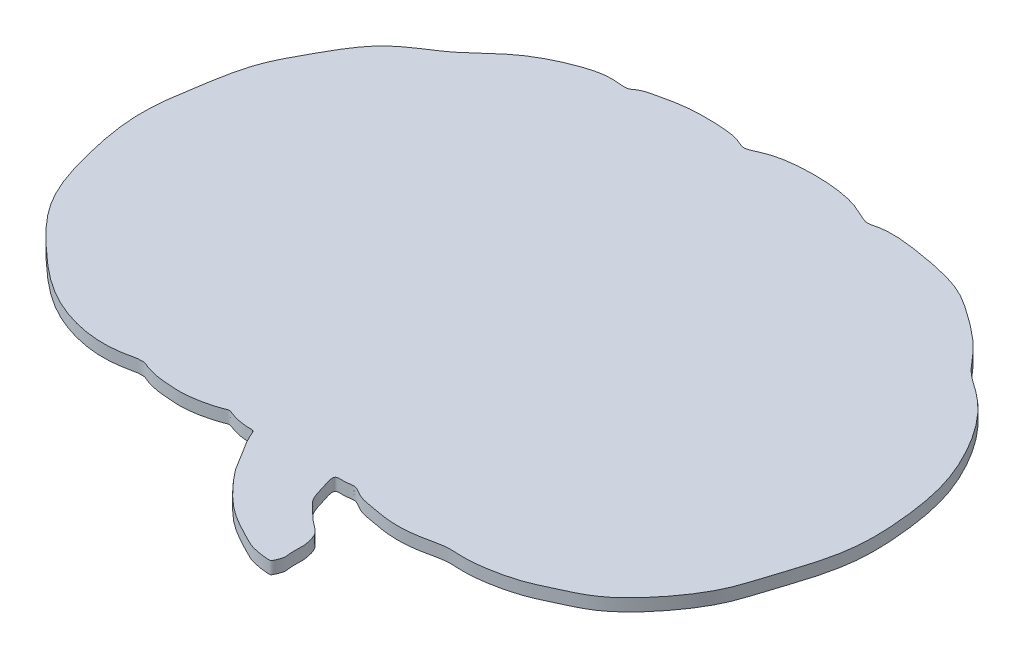
ISO-10303-21;
HEADER;
FILE_DESCRIPTION(('STEP AP214'),'2;1');
FILE_NAME('part.step','',(''),(''),'','','');
FILE_SCHEMA(('AUTOMOTIVE_DESIGN { 1 0 10303 214 1 1 1 1 }'));
ENDSEC;
DATA;
#1=APPLICATION_CONTEXT('core data for automotive mechanical design processes');
#2=APPLICATION_PROTOCOL_DEFINITION('international standard','automotive_design',2000,#1);
#3=PRODUCT_CONTEXT('',#1,'mechanical');
#4=PRODUCT('Part','Part','',(#3));
#5=PRODUCT_RELATED_PRODUCT_CATEGORY('part','',(#4));
#6=PRODUCT_DEFINITION_FORMATION('','',#4);
#7=PRODUCT_DEFINITION_CONTEXT('part definition',#1,'design');
#8=PRODUCT_DEFINITION('design','',#6,#7);
#9=PRODUCT_DEFINITION_SHAPE('','',#8);
#10=(LENGTH_UNIT() NAMED_UNIT(*) SI_UNIT(.MILLI.,.METRE.));
#11=(NAMED_UNIT(*) PLANE_ANGLE_UNIT() SI_UNIT($,.RADIAN.));
#12=(NAMED_UNIT(*) SI_UNIT($,.STERADIAN.) SOLID_ANGLE_UNIT());
#13=UNCERTAINTY_MEASURE_WITH_UNIT(LENGTH_MEASURE(1.E-05),#10,'distance_accuracy_value','');
#14=(GEOMETRIC_REPRESENTATION_CONTEXT(3) GLOBAL_UNCERTAINTY_ASSIGNED_CONTEXT((#13)) GLOBAL_UNIT_ASSIGNED_CONTEXT((#10,
#11,#12)) REPRESENTATION_CONTEXT('',''));
#15=CARTESIAN_POINT('',(0.,0.,0.));
#16=DIRECTION('',(0.,0.,1.));
#17=DIRECTION('',(1.,0.,0.));
#18=AXIS2_PLACEMENT_3D('',#15,#16,#17);
#19=CARTESIAN_POINT('',(0.,0.,0.));
#20=DIRECTION('',(0.,-1.,0.));
#21=DIRECTION('',(0.,0.,-1.));
#22=AXIS2_PLACEMENT_3D('',#19,#20,#21);
#23=PLANE('',#22);
#24=CARTESIAN_POINT('',(34.9509973087976,0.,-45.3626956249762));
#25=CARTESIAN_POINT('',(34.1648318789118,0.,-46.1780783207025));
#26=CARTESIAN_POINT('',(33.0549370221065,0.,-47.9676356757519));
#27=CARTESIAN_POINT('',(27.1539175132988,0.,-52.40684247319));
#28=CARTESIAN_POINT('',(23.6182794553938,0.,-54.2452712699349));
#29=CARTESIAN_POINT('',(12.8534720679056,0.,-56.0499630870907));
#30=CARTESIAN_POINT('',(12.2469343535942,0.,-54.3647886853069));
#31=CARTESIAN_POINT('',(8.86322205531205,0.,-56.5579069707116));
#32=CARTESIAN_POINT('',(3.23216022453953,0.,-57.2290139242764));
#33=CARTESIAN_POINT('',(-2.15734277155484,0.,-56.7336718719648));
#34=CARTESIAN_POINT('',(-4.7434260494536,0.,-55.0345734838977));
#35=CARTESIAN_POINT('',(-5.81252973568001,0.,-56.3212412821953));
#36=CARTESIAN_POINT('',(-12.5292836927238,0.,-56.5654336173178));
#37=CARTESIAN_POINT('',(-14.9011005966641,0.,-55.9708512648485));
#38=CARTESIAN_POINT('',(-18.0980057082823,0.,-55.3025034248081));
#39=CARTESIAN_POINT('',(-18.6106561539237,0.,-54.2404485284891));
#40=CARTESIAN_POINT('',(-21.5738767303892,0.,-55.1466117666649));
#41=CARTESIAN_POINT('',(-27.3011908723438,0.,-52.9405487453433));
#42=CARTESIAN_POINT('',(-30.5304348784394,0.,-50.8328972308383));
#43=CARTESIAN_POINT('',(-33.8527610583914,0.,-47.571927080901));
#44=CARTESIAN_POINT('',(-36.4992648773455,0.,-45.8390408851947));
#45=CARTESIAN_POINT('',(-40.2877536930266,0.,-43.3668654119522));
#46=CARTESIAN_POINT('',(-42.9009385773556,0.,-38.6086381094573));
#47=CARTESIAN_POINT('',(-45.9372504785452,0.,-33.1487997952934));
#48=CARTESIAN_POINT('',(-46.8674396132576,0.,-27.220903425306));
#49=CARTESIAN_POINT('',(-48.0462451026175,0.,-20.122367554084));
#50=CARTESIAN_POINT('',(-46.6575503455411,0.,-12.471424796175));
#51=CARTESIAN_POINT('',(-44.1564065638421,0.,-4.42966991852358));
#52=CARTESIAN_POINT('',(-38.4633886538594,0.,1.28950053539391));
#53=CARTESIAN_POINT('',(-31.892073124528,0.,6.89535813142171));
#54=CARTESIAN_POINT('',(-24.7193909940719,0.,8.61080562312321));
#55=CARTESIAN_POINT('',(-20.5447475654588,0.,7.49047867192958));
#56=CARTESIAN_POINT('',(-19.22741816592,0.,7.44608078692555));
#57=CARTESIAN_POINT('',(-19.2703164463389,0.,7.61579792898738));
#58=CARTESIAN_POINT('',(-17.15743419841,0.,8.24991267340965));
#59=CARTESIAN_POINT('',(-14.5157702658907,0.,8.44102486607606));
#60=CARTESIAN_POINT('',(-13.8146283634914,0.,8.49930701954197));
#61=CARTESIAN_POINT('',(-11.8487651583591,0.,8.3270822883134));
#62=CARTESIAN_POINT('',(-8.86374769848131,0.,7.58312064871491));
#63=CARTESIAN_POINT('',(-8.63195569041808,0.,7.2130316249595));
#64=CARTESIAN_POINT('',(-7.94496749089747,0.,7.55290438875189));
#65=CARTESIAN_POINT('',(-7.22759725109872,0.,7.75234182884578));
#66=CARTESIAN_POINT('',(-6.78960688613859,0.,7.88085006480238));
#67=CARTESIAN_POINT('',(-5.26803414406077,0.,8.14015117154193));
#68=CARTESIAN_POINT('',(-4.60962560377663,0.,7.88886943985154));
#69=CARTESIAN_POINT('',(-4.29045861979046,0.,9.03272670209138));
#70=CARTESIAN_POINT('',(-3.37681196753808,0.,10.5440824259577));
#71=CARTESIAN_POINT('',(-2.66016734474331,0.,11.5773933063289));
#72=CARTESIAN_POINT('',(-1.89926867406118,0.,13.2082662233058));
#73=CARTESIAN_POINT('',(0.639121853100465,0.,16.2217021048073));
#74=CARTESIAN_POINT('',(3.44333857341825,0.,18.76664007545));
#75=CARTESIAN_POINT('',(7.146851366381,0.,20.6201501214173));
#76=CARTESIAN_POINT('',(8.33094794254851,0.,21.330628057913));
#77=CARTESIAN_POINT('',(11.0122098735587,0.,21.6260503357788));
#78=CARTESIAN_POINT('',(11.129229984636,0.,21.4579486988569));
#79=CARTESIAN_POINT('',(11.6581606389544,0.,20.2781792601892));
#80=CARTESIAN_POINT('',(11.4372006099823,0.,19.5518237625111));
#81=CARTESIAN_POINT('',(11.5134542188365,0.,17.9068316562124));
#82=CARTESIAN_POINT('',(11.4780560770579,0.,17.5086542585303));
#83=CARTESIAN_POINT('',(11.0960706879022,0.,15.4814580195064));
#84=CARTESIAN_POINT('',(9.48726717121722,0.,14.5920179144904));
#85=CARTESIAN_POINT('',(8.25237386652394,0.,13.2573425736935));
#86=CARTESIAN_POINT('',(6.88329198408348,0.,12.1596034076821));
#87=CARTESIAN_POINT('',(6.37270203453716,0.,10.4918633259178));
#88=CARTESIAN_POINT('',(5.97455174690053,0.,9.36385554110563));
#89=CARTESIAN_POINT('',(5.59627817711387,0.,7.85090178616584));
#90=CARTESIAN_POINT('',(6.62951754498079,0.,7.89066331786896));
#91=CARTESIAN_POINT('',(7.29356640622377,0.,7.87806099381388));
#92=CARTESIAN_POINT('',(8.41156206616929,0.,7.6138893343645));
#93=CARTESIAN_POINT('',(9.58938086671887,0.,8.65357981888195));
#94=CARTESIAN_POINT('',(11.5587991208524,0.,8.91553572845941));
#95=CARTESIAN_POINT('',(13.7903229169481,0.,9.40880256338869));
#96=CARTESIAN_POINT('',(16.2934719612985,0.,9.46598503474049));
#97=CARTESIAN_POINT('',(18.7268902473448,0.,9.08247804704591));
#98=CARTESIAN_POINT('',(20.917712941431,0.,8.51147301324402));
#99=CARTESIAN_POINT('',(23.4709440930153,0.,8.77858094965656));
#100=CARTESIAN_POINT('',(26.5409583759049,0.,8.39461958084574));
#101=CARTESIAN_POINT('',(29.827797246456,0.,7.60478503927771));
#102=CARTESIAN_POINT('',(32.851151810427,0.,6.11872652186266));
#103=CARTESIAN_POINT('',(36.0860843340558,0.,4.7021332183532));
#104=CARTESIAN_POINT('',(38.9006861000655,0.,2.17343982769089));
#105=CARTESIAN_POINT('',(41.6136480516723,0.,-1.15212690440931));
#106=CARTESIAN_POINT('',(43.839095788238,0.,-4.72368982874038));
#107=CARTESIAN_POINT('',(44.9953954961734,0.,-8.78474733678848));
#108=CARTESIAN_POINT('',(46.4495729027659,0.,-12.9853398638002));
#109=CARTESIAN_POINT('',(47.7006865860593,0.,-18.1611121398252));
#110=CARTESIAN_POINT('',(47.3841801117967,0.,-24.4441042811033));
#111=CARTESIAN_POINT('',(46.358082644211,0.,-30.6699951624975));
#112=CARTESIAN_POINT('',(43.4283166080899,0.,-37.1290253509225));
#113=CARTESIAN_POINT('',(39.5721426576781,0.,-42.2570424563532));
#114=CARTESIAN_POINT('',(35.8965458653564,0.,-44.3820064447117));
#115=CARTESIAN_POINT('',(34.9509973087976,0.,-45.3626956249762));
#116=B_SPLINE_CURVE_WITH_KNOTS('',3,(#24,#25,#26,#27,#28,#29,#30,#31,#32,#33,#34,#35,#36,#37,
#38,#39,#40,#41,#42,#43,#44,#45,#46,#47,#48,#49,#50,#51,#52,#53,#54,#55,#56,#57,#58,#59,#60,#61,
#62,#63,#64,#65,#66,#67,#68,#69,#70,#71,#72,#73,#74,#75,#76,#77,#78,#79,#80,#81,#82,#83,#84,#85,
#86,#87,#88,#89,#90,#91,#92,#93,#94,#95,#96,#97,#98,#99,#100,#101,#102,#103,#104,#105,#106,#107,
#108,#109,#110,#111,#112,#113,#114,#115),.UNSPECIFIED.,.T.,.F.,(4,1,1,1,1,1,1,1,1,1,1,1,1,1,1,1,
1,1,1,1,1,1,1,1,1,1,1,1,1,1,1,1,1,1,1,1,1,1,1,1,1,1,1,1,1,1,1,1,1,1,1,1,1,1,1,1,1,1,1,1,1,1,1,1,
1,1,1,1,1,1,1,1,1,1,1,1,1,1,1,1,1,1,1,1,1,1,1,1,1,4),(0.,0.0125814386226231,0.0218514061170352,
0.0301924514794335,0.0374553802718955,0.0488038078827929,0.056374420789825,0.0641591201125045,
0.0724509547377633,0.0789834564452678,0.0853481823300178,0.092327958093714,0.100034411981791,
0.10184947183712,0.110478556646997,0.123680031086422,0.143068748846985,0.164045512915518,
0.177916207760092,0.185937090895329,0.201348709841306,0.22782480589882,0.246133935926436,
0.271974478271912,0.295025884887771,0.327362491750029,0.359184617834551,0.388613557623827,
0.416913063350752,0.457724703544346,0.463497906359028,0.465472854854284,0.471845881352735,
0.477112479410839,0.480366301448872,0.488424721528467,0.493818067322784,0.498708146191368,
0.5072626071286,0.510940013169176,0.513494468858515,0.515545521544574,0.518533956062368,
0.522910128798632,0.528108254556488,0.532183910092034,0.537728084756887,0.543638757532093,
0.560426517080213,0.576701385675919,0.589340543005376,0.602104402721321,0.605118156182342,
0.607694702401963,0.610196989906367,0.613016072015652,0.616872562158115,0.621645706455579,
0.628107162026627,0.635128646227728,0.64204002199259,0.648735677640917,0.654608596534122,
0.660605327002483,0.664713640995276,0.666968380765842,0.670250720154977,0.672851240880322,
0.679498598428284,0.686578931445382,0.695055102297144,0.705493222321617,0.714679808801071,
0.72300683456972,0.730908159023916,0.7434826002214,0.757962921142584,0.76898454603161,
0.781635938733515,0.797818766906545,0.81119517792303,0.830417450262681,0.844928744698076,
0.85887539125712,0.880944318971677,0.904719026867751,0.929732105070654,0.951984408162297,
0.98486786536673,1.),.UNSPECIFIED.);
#117=CARTESIAN_POINT('',(34.9509973087976,0.,-45.3626956249762));
#118=VERTEX_POINT('',#117);
#119=EDGE_CURVE('E37',#118,#118,#116,.T.);
#120=ORIENTED_EDGE('',*,*,#119,.T.);
#121=EDGE_LOOP('',(#120));
#122=FACE_BOUND('',#121,.T.);
#123=ADVANCED_FACE('F34',(#122),#23,.F.);
#124=CARTESIAN_POINT('',(34.9509973087976,-1.6,-45.3626956249762));
#125=CARTESIAN_POINT('',(34.1648318789118,-1.6,-46.1780783207025));
#126=CARTESIAN_POINT('',(33.0549370221065,-1.6,-47.9676356757519));
#127=CARTESIAN_POINT('',(27.1539175132988,-1.6,-52.40684247319));
#128=CARTESIAN_POINT('',(23.6182794553938,-1.6,-54.2452712699349));
#129=CARTESIAN_POINT('',(12.8534720679056,-1.6,-56.0499630870907));
#130=CARTESIAN_POINT('',(12.2469343535942,-1.6,-54.3647886853069));
#131=CARTESIAN_POINT('',(8.86322205531205,-1.6,-56.5579069707116));
#132=CARTESIAN_POINT('',(3.23216022453953,-1.6,-57.2290139242764));
#133=CARTESIAN_POINT('',(-2.15734277155484,-1.6,-56.7336718719648));
#134=CARTESIAN_POINT('',(-4.7434260494536,-1.6,-55.0345734838977));
#135=CARTESIAN_POINT('',(-5.81252973568001,-1.6,-56.3212412821953));
#136=CARTESIAN_POINT('',(-12.5292836927238,-1.6,-56.5654336173178));
#137=CARTESIAN_POINT('',(-14.9011005966641,-1.6,-55.9708512648485));
#138=CARTESIAN_POINT('',(-18.0980057082823,-1.6,-55.3025034248081));
#139=CARTESIAN_POINT('',(-18.6106561539237,-1.6,-54.2404485284891));
#140=CARTESIAN_POINT('',(-21.5738767303892,-1.6,-55.1466117666649));
#141=CARTESIAN_POINT('',(-27.3011908723438,-1.6,-52.9405487453433));
#142=CARTESIAN_POINT('',(-30.5304348784394,-1.6,-50.8328972308383));
#143=CARTESIAN_POINT('',(-33.8527610583914,-1.6,-47.571927080901));
#144=CARTESIAN_POINT('',(-36.4992648773455,-1.6,-45.8390408851947));
#145=CARTESIAN_POINT('',(-40.2877536930266,-1.6,-43.3668654119522));
#146=CARTESIAN_POINT('',(-42.9009385773556,-1.6,-38.6086381094573));
#147=CARTESIAN_POINT('',(-45.9372504785452,-1.6,-33.1487997952934));
#148=CARTESIAN_POINT('',(-46.8674396132576,-1.6,-27.220903425306));
#149=CARTESIAN_POINT('',(-48.0462451026175,-1.6,-20.122367554084));
#150=CARTESIAN_POINT('',(-46.6575503455411,-1.6,-12.471424796175));
#151=CARTESIAN_POINT('',(-44.1564065638421,-1.6,-4.42966991852358));
#152=CARTESIAN_POINT('',(-38.4633886538594,-1.6,1.28950053539391));
#153=CARTESIAN_POINT('',(-31.892073124528,-1.6,6.89535813142171));
#154=CARTESIAN_POINT('',(-24.7193909940719,-1.6,8.61080562312321));
#155=CARTESIAN_POINT('',(-20.5447475654588,-1.6,7.49047867192958));
#156=CARTESIAN_POINT('',(-19.22741816592,-1.6,7.44608078692555));
#157=CARTESIAN_POINT('',(-19.2703164463389,-1.6,7.61579792898738));
#158=CARTESIAN_POINT('',(-17.15743419841,-1.6,8.24991267340965));
#159=CARTESIAN_POINT('',(-14.5157702658907,-1.6,8.44102486607606));
#160=CARTESIAN_POINT('',(-13.8146283634914,-1.6,8.49930701954197));
#161=CARTESIAN_POINT('',(-11.8487651583591,-1.6,8.3270822883134));
#162=CARTESIAN_POINT('',(-8.86374769848131,-1.6,7.58312064871491));
#163=CARTESIAN_POINT('',(-8.63195569041808,-1.6,7.2130316249595));
#164=CARTESIAN_POINT('',(-7.94496749089747,-1.6,7.55290438875189));
#165=CARTESIAN_POINT('',(-7.22759725109872,-1.6,7.75234182884578));
#166=CARTESIAN_POINT('',(-6.78960688613859,-1.6,7.88085006480238));
#167=CARTESIAN_POINT('',(-5.26803414406077,-1.6,8.14015117154193));
#168=CARTESIAN_POINT('',(-4.60962560377663,-1.6,7.88886943985154));
#169=CARTESIAN_POINT('',(-4.29045861979046,-1.6,9.03272670209138));
#170=CARTESIAN_POINT('',(-3.37681196753808,-1.6,10.5440824259577));
#171=CARTESIAN_POINT('',(-2.66016734474331,-1.6,11.5773933063289));
#172=CARTESIAN_POINT('',(-1.89926867406118,-1.6,13.2082662233058));
#173=CARTESIAN_POINT('',(0.639121853100465,-1.6,16.2217021048073));
#174=CARTESIAN_POINT('',(3.44333857341825,-1.6,18.76664007545));
#175=CARTESIAN_POINT('',(7.146851366381,-1.6,20.6201501214173));
#176=CARTESIAN_POINT('',(8.33094794254851,-1.6,21.330628057913));
#177=CARTESIAN_POINT('',(11.0122098735587,-1.6,21.6260503357788));
#178=CARTESIAN_POINT('',(11.129229984636,-1.6,21.4579486988569));
#179=CARTESIAN_POINT('',(11.6581606389544,-1.6,20.2781792601892));
#180=CARTESIAN_POINT('',(11.4372006099823,-1.6,19.5518237625111));
#181=CARTESIAN_POINT('',(11.5134542188365,-1.6,17.9068316562124));
#182=CARTESIAN_POINT('',(11.4780560770579,-1.6,17.5086542585303));
#183=CARTESIAN_POINT('',(11.0960706879022,-1.6,15.4814580195064));
#184=CARTESIAN_POINT('',(9.48726717121722,-1.6,14.5920179144904));
#185=CARTESIAN_POINT('',(8.25237386652394,-1.6,13.2573425736935));
#186=CARTESIAN_POINT('',(6.88329198408348,-1.6,12.1596034076821));
#187=CARTESIAN_POINT('',(6.37270203453716,-1.6,10.4918633259178));
#188=CARTESIAN_POINT('',(5.97455174690053,-1.6,9.36385554110563));
#189=CARTESIAN_POINT('',(5.59627817711387,-1.6,7.85090178616584));
#190=CARTESIAN_POINT('',(6.62951754498079,-1.6,7.89066331786896));
#191=CARTESIAN_POINT('',(7.29356640622377,-1.6,7.87806099381388));
#192=CARTESIAN_POINT('',(8.41156206616929,-1.6,7.6138893343645));
#193=CARTESIAN_POINT('',(9.58938086671887,-1.6,8.65357981888195));
#194=CARTESIAN_POINT('',(11.5587991208524,-1.6,8.91553572845941));
#195=CARTESIAN_POINT('',(13.7903229169481,-1.6,9.40880256338869));
#196=CARTESIAN_POINT('',(16.2934719612985,-1.6,9.46598503474049));
#197=CARTESIAN_POINT('',(18.7268902473448,-1.6,9.08247804704591));
#198=CARTESIAN_POINT('',(20.917712941431,-1.6,8.51147301324402));
#199=CARTESIAN_POINT('',(23.4709440930153,-1.6,8.77858094965656));
#200=CARTESIAN_POINT('',(26.5409583759049,-1.6,8.39461958084574));
#201=CARTESIAN_POINT('',(29.827797246456,-1.6,7.60478503927771));
#202=CARTESIAN_POINT('',(32.851151810427,-1.6,6.11872652186266));
#203=CARTESIAN_POINT('',(36.0860843340558,-1.6,4.7021332183532));
#204=CARTESIAN_POINT('',(38.9006861000655,-1.6,2.17343982769089));
#205=CARTESIAN_POINT('',(41.6136480516723,-1.6,-1.15212690440931));
#206=CARTESIAN_POINT('',(43.839095788238,-1.6,-4.72368982874038));
#207=CARTESIAN_POINT('',(44.9953954961734,-1.6,-8.78474733678848));
#208=CARTESIAN_POINT('',(46.4495729027659,-1.6,-12.9853398638002));
#209=CARTESIAN_POINT('',(47.7006865860593,-1.6,-18.1611121398252));
#210=CARTESIAN_POINT('',(47.3841801117967,-1.6,-24.4441042811033));
#211=CARTESIAN_POINT('',(46.358082644211,-1.6,-30.6699951624975));
#212=CARTESIAN_POINT('',(43.4283166080899,-1.6,-37.1290253509225));
#213=CARTESIAN_POINT('',(39.5721426576781,-1.6,-42.2570424563532));
#214=CARTESIAN_POINT('',(35.8965458653564,-1.6,-44.3820064447117));
#215=CARTESIAN_POINT('',(34.9509973087976,-1.6,-45.3626956249762));
#216=B_SPLINE_CURVE_WITH_KNOTS('',3,(#124,#125,#126,#127,#128,#129,#130,#131,#132,#133,#134,
#135,#136,#137,#138,#139,#140,#141,#142,#143,#144,#145,#146,#147,#148,#149,#150,#151,#152,#153,
#154,#155,#156,#157,#158,#159,#160,#161,#162,#163,#164,#165,#166,#167,#168,#169,#170,#171,#172,
#173,#174,#175,#176,#177,#178,#179,#180,#181,#182,#183,#184,#185,#186,#187,#188,#189,#190,#191,
#192,#193,#194,#195,#196,#197,#198,#199,#200,#201,#202,#203,#204,#205,#206,#207,#208,#209,#210,
#211,#212,#213,#214,#215),.UNSPECIFIED.,.T.,.F.,(4,1,1,1,1,1,1,1,1,1,1,1,1,1,1,1,1,1,1,1,1,1,1,
1,1,1,1,1,1,1,1,1,1,1,1,1,1,1,1,1,1,1,1,1,1,1,1,1,1,1,1,1,1,1,1,1,1,1,1,1,1,1,1,1,1,1,1,1,1,1,1,
1,1,1,1,1,1,1,1,1,1,1,1,1,1,1,1,1,1,4),(0.,0.0125814386226231,0.0218514061170352,
0.0301924514794335,0.0374553802718955,0.0488038078827929,0.056374420789825,0.0641591201125045,
0.0724509547377633,0.0789834564452678,0.0853481823300178,0.092327958093714,0.100034411981791,
0.10184947183712,0.110478556646997,0.123680031086422,0.143068748846985,0.164045512915518,
0.177916207760092,0.185937090895329,0.201348709841306,0.22782480589882,0.246133935926436,
0.271974478271912,0.295025884887771,0.327362491750029,0.359184617834551,0.388613557623827,
0.416913063350752,0.457724703544346,0.463497906359028,0.465472854854284,0.471845881352735,
0.477112479410839,0.480366301448872,0.488424721528467,0.493818067322784,0.498708146191368,
0.5072626071286,0.510940013169176,0.513494468858515,0.515545521544574,0.518533956062368,
0.522910128798632,0.528108254556488,0.532183910092034,0.537728084756887,0.543638757532093,
0.560426517080213,0.576701385675919,0.589340543005376,0.602104402721321,0.605118156182342,
0.607694702401963,0.610196989906367,0.613016072015652,0.616872562158115,0.621645706455579,
0.628107162026627,0.635128646227728,0.64204002199259,0.648735677640917,0.654608596534122,
0.660605327002483,0.664713640995276,0.666968380765842,0.670250720154977,0.672851240880322,
0.679498598428284,0.686578931445382,0.695055102297144,0.705493222321617,0.714679808801071,
0.72300683456972,0.730908159023916,0.7434826002214,0.757962921142584,0.76898454603161,
0.781635938733515,0.797818766906545,0.81119517792303,0.830417450262681,0.844928744698076,
0.85887539125712,0.880944318971677,0.904719026867751,0.929732105070654,0.951984408162297,
0.98486786536673,1.),.UNSPECIFIED.);
#217=DIRECTION('',(0.,1.,0.));
#218=VECTOR('',#217,1.);
#219=SURFACE_OF_LINEAR_EXTRUSION('',#216,#218);
#220=CARTESIAN_POINT('',(34.9509973087976,-1.6,-45.3626956249762));
#221=VERTEX_POINT('',#220);
#222=EDGE_CURVE('E11',#221,#221,#216,.T.);
#223=ORIENTED_EDGE('',*,*,#222,.T.);
#224=EDGE_LOOP('',(#223));
#225=FACE_BOUND('',#224,.T.);
#226=ORIENTED_EDGE('',*,*,#119,.F.);
#227=EDGE_LOOP('',(#226));
#228=FACE_BOUND('',#227,.T.);
#229=ADVANCED_FACE('F53',(#225,#228),#219,.T.);
#230=CARTESIAN_POINT('',(0.,-1.6,0.));
#231=DIRECTION('',(0.,-1.,0.));
#232=DIRECTION('',(0.,0.,-1.));
#233=AXIS2_PLACEMENT_3D('',#230,#231,#232);
#234=PLANE('',#233);
#235=ORIENTED_EDGE('',*,*,#222,.F.);
#236=EDGE_LOOP('',(#235));
#237=FACE_BOUND('',#236,.T.);
#238=ADVANCED_FACE('F55',(#237),#234,.T.);
#239=CLOSED_SHELL('',(#123,#229,#238));
#240=MANIFOLD_SOLID_BREP('B2',#239);
#241=ADVANCED_BREP_SHAPE_REPRESENTATION('',(#18,#240),#14);
#242=SHAPE_DEFINITION_REPRESENTATION(#9,#241);
ENDSEC;
END-ISO-10303-21;
